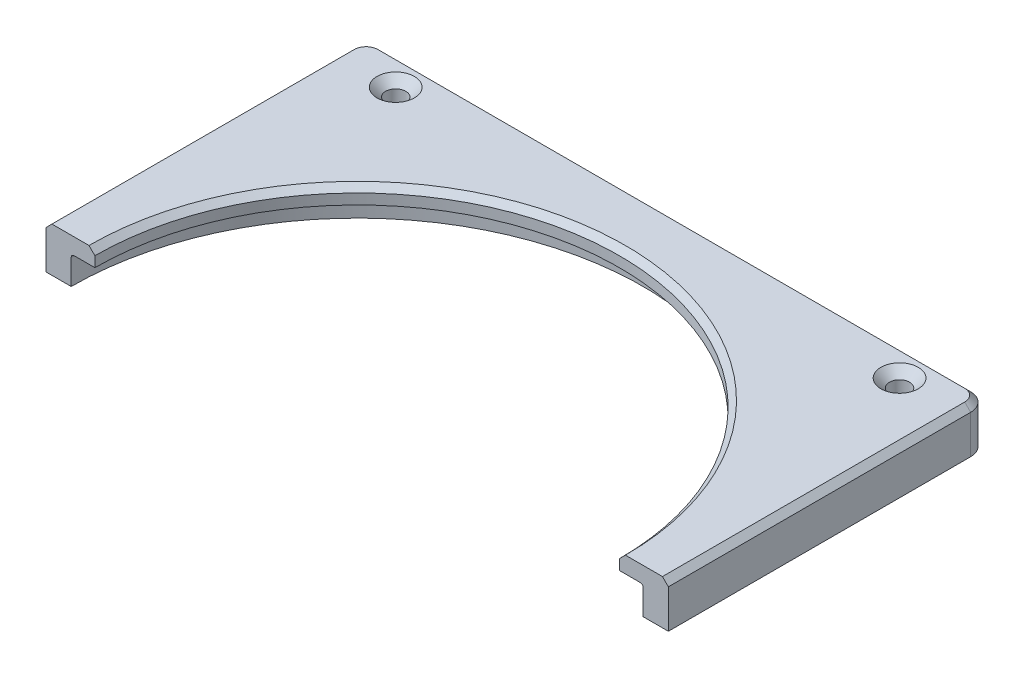
ISO-10303-21;
HEADER;
FILE_DESCRIPTION(('STEP AP214'),'2;1');
FILE_NAME('part.step','',(''),(''),'','','');
FILE_SCHEMA(('AUTOMOTIVE_DESIGN { 1 0 10303 214 1 1 1 1 }'));
ENDSEC;
DATA;
#1=APPLICATION_CONTEXT('core data for automotive mechanical design processes');
#2=APPLICATION_PROTOCOL_DEFINITION('international standard','automotive_design',2000,#1);
#3=PRODUCT_CONTEXT('',#1,'mechanical');
#4=PRODUCT('Part','Part','',(#3));
#5=PRODUCT_RELATED_PRODUCT_CATEGORY('part','',(#4));
#6=PRODUCT_DEFINITION_FORMATION('','',#4);
#7=PRODUCT_DEFINITION_CONTEXT('part definition',#1,'design');
#8=PRODUCT_DEFINITION('design','',#6,#7);
#9=PRODUCT_DEFINITION_SHAPE('','',#8);
#10=(LENGTH_UNIT() NAMED_UNIT(*) SI_UNIT(.MILLI.,.METRE.));
#11=(NAMED_UNIT(*) PLANE_ANGLE_UNIT() SI_UNIT($,.RADIAN.));
#12=(NAMED_UNIT(*) SI_UNIT($,.STERADIAN.) SOLID_ANGLE_UNIT());
#13=UNCERTAINTY_MEASURE_WITH_UNIT(LENGTH_MEASURE(1.E-05),#10,'distance_accuracy_value','');
#14=(GEOMETRIC_REPRESENTATION_CONTEXT(3) GLOBAL_UNCERTAINTY_ASSIGNED_CONTEXT((#13)) GLOBAL_UNIT_ASSIGNED_CONTEXT((#10,
#11,#12)) REPRESENTATION_CONTEXT('',''));
#15=CARTESIAN_POINT('',(0.,0.,0.));
#16=DIRECTION('',(0.,0.,1.));
#17=DIRECTION('',(1.,0.,0.));
#18=AXIS2_PLACEMENT_3D('',#15,#16,#17);
#19=CARTESIAN_POINT('',(-52.5,7.5,27.));
#20=DIRECTION('',(0.,0.,-1.));
#21=DIRECTION('',(-1.,0.,0.));
#22=AXIS2_PLACEMENT_3D('',#19,#20,#21);
#23=PLANE('',#22);
#24=DIRECTION('',(0.,1.,0.));
#25=VECTOR('',#24,1.);
#26=CARTESIAN_POINT('',(-44.25,0.,27.));
#27=LINE('',#26,#25);
#28=CARTESIAN_POINT('',(-44.25,4.75,27.));
#29=VERTEX_POINT('',#28);
#30=CARTESIAN_POINT('',(-44.25,6.49999999999997,27.));
#31=VERTEX_POINT('',#30);
#32=EDGE_CURVE('E175',#29,#31,#27,.T.);
#33=ORIENTED_EDGE('',*,*,#32,.T.);
#34=DIRECTION('',(-0.707106781186545,0.70710678118655,0.));
#35=VECTOR('',#34,1.);
#36=CARTESIAN_POINT('',(0.,-37.7500000000003,27.));
#37=LINE('',#36,#35);
#38=CARTESIAN_POINT('',(-45.25,7.5,27.));
#39=VERTEX_POINT('',#38);
#40=EDGE_CURVE('E210',#31,#39,#37,.T.);
#41=ORIENTED_EDGE('',*,*,#40,.T.);
#42=DIRECTION('',(1.,0.,0.));
#43=VECTOR('',#42,1.);
#44=CARTESIAN_POINT('',(-52.5,7.5,27.));
#45=LINE('',#44,#43);
#46=CARTESIAN_POINT('',(-51.5,7.5,27.));
#47=VERTEX_POINT('',#46);
#48=EDGE_CURVE('E323',#47,#39,#45,.T.);
#49=ORIENTED_EDGE('',*,*,#48,.F.);
#50=DIRECTION('',(-0.707106781186543,-0.707106781186552,0.));
#51=VECTOR('',#50,1.);
#52=CARTESIAN_POINT('',(-51.5,7.5,27.));
#53=LINE('',#52,#51);
#54=CARTESIAN_POINT('',(-52.5,6.49999999999997,27.));
#55=VERTEX_POINT('',#54);
#56=EDGE_CURVE('E207',#47,#55,#53,.T.);
#57=ORIENTED_EDGE('',*,*,#56,.T.);
#58=DIRECTION('',(0.,-1.,0.));
#59=VECTOR('',#58,1.);
#60=CARTESIAN_POINT('',(-52.5,7.5,27.));
#61=LINE('',#60,#59);
#62=CARTESIAN_POINT('',(-52.5,0.,27.));
#63=VERTEX_POINT('',#62);
#64=EDGE_CURVE('E343',#55,#63,#61,.T.);
#65=ORIENTED_EDGE('',*,*,#64,.T.);
#66=DIRECTION('',(1.,0.,0.));
#67=VECTOR('',#66,1.);
#68=CARTESIAN_POINT('',(-52.5,0.,27.));
#69=LINE('',#68,#67);
#70=CARTESIAN_POINT('',(-48.25,0.,27.));
#71=VERTEX_POINT('',#70);
#72=EDGE_CURVE('E324',#63,#71,#69,.T.);
#73=ORIENTED_EDGE('',*,*,#72,.T.);
#74=DIRECTION('',(0.,-1.,0.));
#75=VECTOR('',#74,1.);
#76=CARTESIAN_POINT('',(-48.25,4.75,27.));
#77=LINE('',#76,#75);
#78=CARTESIAN_POINT('',(-48.25,4.25,27.));
#79=VERTEX_POINT('',#78);
#80=EDGE_CURVE('E312',#71,#79,#77,.F.);
#81=ORIENTED_EDGE('',*,*,#80,.T.);
#82=CARTESIAN_POINT('',(-47.75,4.25,27.));
#83=DIRECTION('',(0.,0.,-1.));
#84=DIRECTION('',(-1.,0.,0.));
#85=AXIS2_PLACEMENT_3D('',#82,#83,#84);
#86=CIRCLE('',#85,0.5);
#87=CARTESIAN_POINT('',(-47.75,4.75,27.));
#88=VERTEX_POINT('',#87);
#89=EDGE_CURVE('E11',#79,#88,#86,.T.);
#90=ORIENTED_EDGE('',*,*,#89,.T.);
#91=DIRECTION('',(-1.,0.,0.));
#92=VECTOR('',#91,1.);
#93=CARTESIAN_POINT('',(-52.5,4.75,27.));
#94=LINE('',#93,#92);
#95=EDGE_CURVE('E163',#29,#88,#94,.T.);
#96=ORIENTED_EDGE('',*,*,#95,.F.);
#97=EDGE_LOOP('',(#33,#41,#49,#57,#65,#73,#81,#90,#96));
#98=FACE_BOUND('',#97,.T.);
#99=ADVANCED_FACE('F47',(#98),#23,.F.);
#100=CARTESIAN_POINT('',(52.5,7.5,-27.));
#101=DIRECTION('',(-1.,0.,0.));
#102=DIRECTION('',(0.,0.,1.));
#103=AXIS2_PLACEMENT_3D('',#100,#101,#102);
#104=PLANE('',#103);
#105=DIRECTION('',(0.,-1.,0.));
#106=VECTOR('',#105,1.);
#107=CARTESIAN_POINT('',(52.5,7.5,-24.));
#108=LINE('',#107,#106);
#109=CARTESIAN_POINT('',(52.5,0.,-24.));
#110=VERTEX_POINT('',#109);
#111=CARTESIAN_POINT('',(52.5,6.49999999999997,-24.));
#112=VERTEX_POINT('',#111);
#113=EDGE_CURVE('E200',#110,#112,#108,.F.);
#114=ORIENTED_EDGE('',*,*,#113,.T.);
#115=DIRECTION('',(0.,0.,1.));
#116=VECTOR('',#115,1.);
#117=CARTESIAN_POINT('',(52.5,6.49999999999997,27.));
#118=LINE('',#117,#116);
#119=CARTESIAN_POINT('',(52.5,6.49999999999997,27.));
#120=VERTEX_POINT('',#119);
#121=EDGE_CURVE('E249',#112,#120,#118,.T.);
#122=ORIENTED_EDGE('',*,*,#121,.T.);
#123=DIRECTION('',(0.,-1.,0.));
#124=VECTOR('',#123,1.);
#125=CARTESIAN_POINT('',(52.5,7.5,27.));
#126=LINE('',#125,#124);
#127=CARTESIAN_POINT('',(52.5,0.,27.));
#128=VERTEX_POINT('',#127);
#129=EDGE_CURVE('E340',#120,#128,#126,.T.);
#130=ORIENTED_EDGE('',*,*,#129,.T.);
#131=DIRECTION('',(0.,0.,-1.));
#132=VECTOR('',#131,1.);
#133=CARTESIAN_POINT('',(52.5,0.,-27.));
#134=LINE('',#133,#132);
#135=EDGE_CURVE('E318',#128,#110,#134,.T.);
#136=ORIENTED_EDGE('',*,*,#135,.T.);
#137=EDGE_LOOP('',(#114,#122,#130,#136));
#138=FACE_BOUND('',#137,.T.);
#139=ADVANCED_FACE('F388',(#138),#104,.F.);
#140=CARTESIAN_POINT('',(-52.5,7.5,-27.));
#141=DIRECTION('',(0.,0.,1.));
#142=DIRECTION('',(1.,0.,0.));
#143=AXIS2_PLACEMENT_3D('',#140,#141,#142);
#144=PLANE('',#143);
#145=DIRECTION('',(0.,-1.,0.));
#146=VECTOR('',#145,1.);
#147=CARTESIAN_POINT('',(-49.5,7.5,-27.));
#148=LINE('',#147,#146);
#149=CARTESIAN_POINT('',(-49.5,0.,-27.));
#150=VERTEX_POINT('',#149);
#151=CARTESIAN_POINT('',(-49.5,6.49999999999997,-27.));
#152=VERTEX_POINT('',#151);
#153=EDGE_CURVE('E196',#150,#152,#148,.F.);
#154=ORIENTED_EDGE('',*,*,#153,.T.);
#155=DIRECTION('',(1.,0.,0.));
#156=VECTOR('',#155,1.);
#157=CARTESIAN_POINT('',(49.5,6.49999999999997,-27.));
#158=LINE('',#157,#156);
#159=CARTESIAN_POINT('',(49.5,6.49999999999997,-27.));
#160=VERTEX_POINT('',#159);
#161=EDGE_CURVE('E243',#152,#160,#158,.T.);
#162=ORIENTED_EDGE('',*,*,#161,.T.);
#163=DIRECTION('',(0.,-1.,0.));
#164=VECTOR('',#163,1.);
#165=CARTESIAN_POINT('',(49.5,7.5,-27.));
#166=LINE('',#165,#164);
#167=CARTESIAN_POINT('',(49.5,0.,-27.));
#168=VERTEX_POINT('',#167);
#169=EDGE_CURVE('E193',#160,#168,#166,.T.);
#170=ORIENTED_EDGE('',*,*,#169,.T.);
#171=DIRECTION('',(-1.,0.,0.));
#172=VECTOR('',#171,1.);
#173=CARTESIAN_POINT('',(-52.5,0.,-27.));
#174=LINE('',#173,#172);
#175=EDGE_CURVE('E328',#168,#150,#174,.T.);
#176=ORIENTED_EDGE('',*,*,#175,.T.);
#177=EDGE_LOOP('',(#154,#162,#170,#176));
#178=FACE_BOUND('',#177,.T.);
#179=ADVANCED_FACE('F395',(#178),#144,.F.);
#180=CARTESIAN_POINT('',(-52.5,7.5,-27.));
#181=DIRECTION('',(1.,0.,0.));
#182=DIRECTION('',(0.,0.,-1.));
#183=AXIS2_PLACEMENT_3D('',#180,#181,#182);
#184=PLANE('',#183);
#185=ORIENTED_EDGE('',*,*,#64,.F.);
#186=DIRECTION('',(0.,0.,-1.));
#187=VECTOR('',#186,1.);
#188=CARTESIAN_POINT('',(-52.5,6.49999999999997,-24.));
#189=LINE('',#188,#187);
#190=CARTESIAN_POINT('',(-52.5,6.49999999999997,-24.));
#191=VERTEX_POINT('',#190);
#192=EDGE_CURVE('E237',#55,#191,#189,.T.);
#193=ORIENTED_EDGE('',*,*,#192,.T.);
#194=DIRECTION('',(0.,-1.,0.));
#195=VECTOR('',#194,1.);
#196=CARTESIAN_POINT('',(-52.5,7.5,-24.));
#197=LINE('',#196,#195);
#198=CARTESIAN_POINT('',(-52.5,0.,-24.));
#199=VERTEX_POINT('',#198);
#200=EDGE_CURVE('E181',#191,#199,#197,.T.);
#201=ORIENTED_EDGE('',*,*,#200,.T.);
#202=DIRECTION('',(0.,0.,1.));
#203=VECTOR('',#202,1.);
#204=CARTESIAN_POINT('',(-52.5,0.,-27.));
#205=LINE('',#204,#203);
#206=EDGE_CURVE('E332',#199,#63,#205,.T.);
#207=ORIENTED_EDGE('',*,*,#206,.T.);
#208=EDGE_LOOP('',(#185,#193,#201,#207));
#209=FACE_BOUND('',#208,.T.);
#210=ADVANCED_FACE('F400',(#209),#184,.F.);
#211=CARTESIAN_POINT('',(45.25,7.5,27.));
#212=VERTEX_POINT('',#211);
#213=CARTESIAN_POINT('',(51.5,7.5,27.));
#214=VERTEX_POINT('',#213);
#215=EDGE_CURVE('E319',#212,#214,#45,.T.);
#216=ORIENTED_EDGE('',*,*,#215,.F.);
#217=DIRECTION('',(-0.707106781186545,-0.70710678118655,0.));
#218=VECTOR('',#217,1.);
#219=CARTESIAN_POINT('',(0.,-37.7500000000003,27.));
#220=LINE('',#219,#218);
#221=CARTESIAN_POINT('',(44.25,6.49999999999997,27.));
#222=VERTEX_POINT('',#221);
#223=EDGE_CURVE('E170',#212,#222,#220,.T.);
#224=ORIENTED_EDGE('',*,*,#223,.T.);
#225=DIRECTION('',(0.,1.,0.));
#226=VECTOR('',#225,1.);
#227=CARTESIAN_POINT('',(44.25,0.,27.));
#228=LINE('',#227,#226);
#229=CARTESIAN_POINT('',(44.25,4.75,27.));
#230=VERTEX_POINT('',#229);
#231=EDGE_CURVE('E166',#222,#230,#228,.F.);
#232=ORIENTED_EDGE('',*,*,#231,.T.);
#233=CARTESIAN_POINT('',(47.75,4.75,27.));
#234=VERTEX_POINT('',#233);
#235=EDGE_CURVE('E153',#234,#230,#94,.T.);
#236=ORIENTED_EDGE('',*,*,#235,.F.);
#237=CARTESIAN_POINT('',(47.75,4.25,27.));
#238=DIRECTION('',(0.,0.,-1.));
#239=DIRECTION('',(-1.,0.,0.));
#240=AXIS2_PLACEMENT_3D('',#237,#238,#239);
#241=CIRCLE('',#240,0.5);
#242=CARTESIAN_POINT('',(48.25,4.25,27.));
#243=VERTEX_POINT('',#242);
#244=EDGE_CURVE('E56',#234,#243,#241,.T.);
#245=ORIENTED_EDGE('',*,*,#244,.T.);
#246=DIRECTION('',(0.,-1.,0.));
#247=VECTOR('',#246,1.);
#248=CARTESIAN_POINT('',(48.25,4.75,27.));
#249=LINE('',#248,#247);
#250=CARTESIAN_POINT('',(48.25,0.,27.));
#251=VERTEX_POINT('',#250);
#252=EDGE_CURVE('E315',#243,#251,#249,.T.);
#253=ORIENTED_EDGE('',*,*,#252,.T.);
#254=EDGE_CURVE('E336',#251,#128,#69,.T.);
#255=ORIENTED_EDGE('',*,*,#254,.T.);
#256=ORIENTED_EDGE('',*,*,#129,.F.);
#257=DIRECTION('',(-0.707106781186543,0.707106781186552,0.));
#258=VECTOR('',#257,1.);
#259=CARTESIAN_POINT('',(51.5,7.5,27.));
#260=LINE('',#259,#258);
#261=EDGE_CURVE('E232',#120,#214,#260,.T.);
#262=ORIENTED_EDGE('',*,*,#261,.T.);
#263=EDGE_LOOP('',(#216,#224,#232,#236,#245,#253,#255,#256,#262));
#264=FACE_BOUND('',#263,.T.);
#265=ADVANCED_FACE('F168',(#264),#23,.F.);
#266=CARTESIAN_POINT('',(0.,7.5,0.));
#267=DIRECTION('',(0.,1.,0.));
#268=DIRECTION('',(0.,0.,1.));
#269=AXIS2_PLACEMENT_3D('',#266,#267,#268);
#270=PLANE('',#269);
#271=CARTESIAN_POINT('',(-42.5,7.5,-22.));
#272=DIRECTION('',(0.,1.,0.));
#273=DIRECTION('',(0.,0.,1.));
#274=AXIS2_PLACEMENT_3D('',#271,#272,#273);
#275=CIRCLE('',#274,3.15);
#276=CARTESIAN_POINT('',(-42.5,7.5,-18.85));
#277=VERTEX_POINT('',#276);
#278=EDGE_CURVE('E279',#277,#277,#275,.T.);
#279=ORIENTED_EDGE('',*,*,#278,.F.);
#280=EDGE_LOOP('',(#279));
#281=FACE_BOUND('',#280,.T.);
#282=CARTESIAN_POINT('',(42.5,7.5,-22.));
#283=DIRECTION('',(0.,1.,0.));
#284=DIRECTION('',(0.,0.,1.));
#285=AXIS2_PLACEMENT_3D('',#282,#283,#284);
#286=CIRCLE('',#285,3.15);
#287=CARTESIAN_POINT('',(42.5,7.5,-18.85));
#288=VERTEX_POINT('',#287);
#289=EDGE_CURVE('E299',#288,#288,#286,.T.);
#290=ORIENTED_EDGE('',*,*,#289,.F.);
#291=EDGE_LOOP('',(#290));
#292=FACE_BOUND('',#291,.T.);
#293=ORIENTED_EDGE('',*,*,#48,.T.);
#294=CARTESIAN_POINT('',(0.,7.5,27.));
#295=DIRECTION('',(0.,1.,0.));
#296=DIRECTION('',(0.,0.,1.));
#297=AXIS2_PLACEMENT_3D('',#294,#295,#296);
#298=CIRCLE('',#297,45.25);
#299=EDGE_CURVE('E229',#39,#212,#298,.F.);
#300=ORIENTED_EDGE('',*,*,#299,.T.);
#301=ORIENTED_EDGE('',*,*,#215,.T.);
#302=DIRECTION('',(0.,0.,-1.));
#303=VECTOR('',#302,1.);
#304=CARTESIAN_POINT('',(51.5,7.5,-24.));
#305=LINE('',#304,#303);
#306=CARTESIAN_POINT('',(51.5,7.5,-24.));
#307=VERTEX_POINT('',#306);
#308=EDGE_CURVE('E213',#214,#307,#305,.T.);
#309=ORIENTED_EDGE('',*,*,#308,.T.);
#310=CARTESIAN_POINT('',(49.5,7.5,-24.));
#311=DIRECTION('',(0.,1.,0.));
#312=DIRECTION('',(0.,0.,1.));
#313=AXIS2_PLACEMENT_3D('',#310,#311,#312);
#314=CIRCLE('',#313,1.99999999999999);
#315=CARTESIAN_POINT('',(49.5,7.5,-26.));
#316=VERTEX_POINT('',#315);
#317=EDGE_CURVE('E216',#307,#316,#314,.T.);
#318=ORIENTED_EDGE('',*,*,#317,.T.);
#319=DIRECTION('',(-1.,0.,0.));
#320=VECTOR('',#319,1.);
#321=CARTESIAN_POINT('',(-49.5,7.5,-26.));
#322=LINE('',#321,#320);
#323=CARTESIAN_POINT('',(-49.5,7.5,-26.));
#324=VERTEX_POINT('',#323);
#325=EDGE_CURVE('E219',#316,#324,#322,.T.);
#326=ORIENTED_EDGE('',*,*,#325,.T.);
#327=CARTESIAN_POINT('',(-49.5,7.5,-24.));
#328=DIRECTION('',(0.,1.,0.));
#329=DIRECTION('',(0.,0.,1.));
#330=AXIS2_PLACEMENT_3D('',#327,#328,#329);
#331=CIRCLE('',#330,1.99999999999998);
#332=CARTESIAN_POINT('',(-51.5,7.5,-24.));
#333=VERTEX_POINT('',#332);
#334=EDGE_CURVE('E222',#324,#333,#331,.T.);
#335=ORIENTED_EDGE('',*,*,#334,.T.);
#336=DIRECTION('',(0.,0.,1.));
#337=VECTOR('',#336,1.);
#338=CARTESIAN_POINT('',(-51.5,7.5,27.));
#339=LINE('',#338,#337);
#340=EDGE_CURVE('E225',#333,#47,#339,.T.);
#341=ORIENTED_EDGE('',*,*,#340,.T.);
#342=EDGE_LOOP('',(#293,#300,#301,#309,#318,#326,#335,#341));
#343=FACE_BOUND('',#342,.T.);
#344=ADVANCED_FACE('F368',(#281,#292,#343),#270,.T.);
#345=CARTESIAN_POINT('',(0.,0.,0.));
#346=DIRECTION('',(0.,1.,0.));
#347=DIRECTION('',(0.,0.,1.));
#348=AXIS2_PLACEMENT_3D('',#345,#346,#347);
#349=PLANE('',#348);
#350=CARTESIAN_POINT('',(-42.5,0.,-22.));
#351=DIRECTION('',(0.,1.,0.));
#352=DIRECTION('',(0.,0.,1.));
#353=AXIS2_PLACEMENT_3D('',#350,#351,#352);
#354=CIRCLE('',#353,2.2);
#355=CARTESIAN_POINT('',(-42.5,0.,-19.8));
#356=VERTEX_POINT('',#355);
#357=EDGE_CURVE('E268',#356,#356,#354,.T.);
#358=ORIENTED_EDGE('',*,*,#357,.T.);
#359=EDGE_LOOP('',(#358));
#360=FACE_BOUND('',#359,.T.);
#361=CARTESIAN_POINT('',(42.5,0.,-22.));
#362=DIRECTION('',(0.,1.,0.));
#363=DIRECTION('',(0.,0.,1.));
#364=AXIS2_PLACEMENT_3D('',#361,#362,#363);
#365=CIRCLE('',#364,2.2);
#366=CARTESIAN_POINT('',(42.5,0.,-19.8));
#367=VERTEX_POINT('',#366);
#368=EDGE_CURVE('E295',#367,#367,#365,.T.);
#369=ORIENTED_EDGE('',*,*,#368,.T.);
#370=EDGE_LOOP('',(#369));
#371=FACE_BOUND('',#370,.T.);
#372=ORIENTED_EDGE('',*,*,#206,.F.);
#373=CARTESIAN_POINT('',(-49.5,0.,-24.));
#374=DIRECTION('',(0.,1.,0.));
#375=DIRECTION('',(0.,0.,1.));
#376=AXIS2_PLACEMENT_3D('',#373,#374,#375);
#377=CIRCLE('',#376,3.);
#378=EDGE_CURVE('E190',#199,#150,#377,.F.);
#379=ORIENTED_EDGE('',*,*,#378,.T.);
#380=ORIENTED_EDGE('',*,*,#175,.F.);
#381=CARTESIAN_POINT('',(49.5,0.,-24.));
#382=DIRECTION('',(0.,1.,0.));
#383=DIRECTION('',(0.,0.,1.));
#384=AXIS2_PLACEMENT_3D('',#381,#382,#383);
#385=CIRCLE('',#384,3.);
#386=EDGE_CURVE('E184',#168,#110,#385,.F.);
#387=ORIENTED_EDGE('',*,*,#386,.T.);
#388=ORIENTED_EDGE('',*,*,#135,.F.);
#389=ORIENTED_EDGE('',*,*,#254,.F.);
#390=CARTESIAN_POINT('',(0.,0.,27.));
#391=DIRECTION('',(0.,1.,0.));
#392=DIRECTION('',(0.,0.,1.));
#393=AXIS2_PLACEMENT_3D('',#390,#391,#392);
#394=CIRCLE('',#393,48.25);
#395=EDGE_CURVE('E345',#251,#71,#394,.T.);
#396=ORIENTED_EDGE('',*,*,#395,.T.);
#397=ORIENTED_EDGE('',*,*,#72,.F.);
#398=EDGE_LOOP('',(#372,#379,#380,#387,#388,#389,#396,#397));
#399=FACE_BOUND('',#398,.T.);
#400=ADVANCED_FACE('F360',(#360,#371,#399),#349,.F.);
#401=CARTESIAN_POINT('',(0.,4.75,27.));
#402=DIRECTION('',(0.,-1.,0.));
#403=DIRECTION('',(0.,0.,-1.));
#404=AXIS2_PLACEMENT_3D('',#401,#402,#403);
#405=PLANE('',#404);
#406=ORIENTED_EDGE('',*,*,#95,.T.);
#407=CARTESIAN_POINT('',(0.,4.75,27.));
#408=DIRECTION('',(0.,-1.,0.));
#409=DIRECTION('',(0.,0.,-1.));
#410=AXIS2_PLACEMENT_3D('',#407,#408,#409);
#411=CIRCLE('',#410,47.75);
#412=EDGE_CURVE('E161',#88,#234,#411,.T.);
#413=ORIENTED_EDGE('',*,*,#412,.T.);
#414=ORIENTED_EDGE('',*,*,#235,.T.);
#415=CARTESIAN_POINT('',(0.,4.75,27.));
#416=DIRECTION('',(0.,-1.,0.));
#417=DIRECTION('',(0.,0.,-1.));
#418=AXIS2_PLACEMENT_3D('',#415,#416,#417);
#419=CIRCLE('',#418,44.25);
#420=EDGE_CURVE('E158',#29,#230,#419,.T.);
#421=ORIENTED_EDGE('',*,*,#420,.F.);
#422=EDGE_LOOP('',(#406,#413,#414,#421));
#423=FACE_BOUND('',#422,.T.);
#424=ADVANCED_FACE('F156',(#423),#405,.T.);
#425=CARTESIAN_POINT('',(0.,4.75,27.));
#426=DIRECTION('',(0.,-1.,0.));
#427=DIRECTION('',(0.,0.,-1.));
#428=AXIS2_PLACEMENT_3D('',#425,#426,#427);
#429=CYLINDRICAL_SURFACE('',#428,48.25);
#430=ORIENTED_EDGE('',*,*,#252,.F.);
#431=CARTESIAN_POINT('',(0.,4.25,27.));
#432=DIRECTION('',(0.,-1.,0.));
#433=DIRECTION('',(0.,0.,-1.));
#434=AXIS2_PLACEMENT_3D('',#431,#432,#433);
#435=CIRCLE('',#434,48.25);
#436=EDGE_CURVE('E69',#243,#79,#435,.F.);
#437=ORIENTED_EDGE('',*,*,#436,.T.);
#438=ORIENTED_EDGE('',*,*,#80,.F.);
#439=ORIENTED_EDGE('',*,*,#395,.F.);
#440=EDGE_LOOP('',(#430,#437,#438,#439));
#441=FACE_BOUND('',#440,.T.);
#442=ADVANCED_FACE('F356',(#441),#429,.F.);
#443=CARTESIAN_POINT('',(0.,0.,27.));
#444=DIRECTION('',(0.,1.,0.));
#445=DIRECTION('',(0.,0.,1.));
#446=AXIS2_PLACEMENT_3D('',#443,#444,#445);
#447=CYLINDRICAL_SURFACE('',#446,44.25);
#448=ORIENTED_EDGE('',*,*,#231,.F.);
#449=CARTESIAN_POINT('',(0.,6.49999999999997,27.));
#450=DIRECTION('',(0.,1.,0.));
#451=DIRECTION('',(0.,0.,1.));
#452=AXIS2_PLACEMENT_3D('',#449,#450,#451);
#453=CIRCLE('',#452,44.25);
#454=EDGE_CURVE('E204',#222,#31,#453,.T.);
#455=ORIENTED_EDGE('',*,*,#454,.T.);
#456=ORIENTED_EDGE('',*,*,#32,.F.);
#457=ORIENTED_EDGE('',*,*,#420,.T.);
#458=EDGE_LOOP('',(#448,#455,#456,#457));
#459=FACE_BOUND('',#458,.T.);
#460=ADVANCED_FACE('F178',(#459),#447,.F.);
#461=CARTESIAN_POINT('',(42.5,0.500000000000021,-22.));
#462=DIRECTION('',(0.,-1.,0.));
#463=DIRECTION('',(0.,0.,-1.));
#464=AXIS2_PLACEMENT_3D('',#461,#462,#463);
#465=CONICAL_SURFACE('',#464,1.69999999999999,0.785398163397448);
#466=ORIENTED_EDGE('',*,*,#368,.F.);
#467=EDGE_LOOP('',(#466));
#468=FACE_BOUND('',#467,.T.);
#469=CARTESIAN_POINT('',(42.5,0.500000000000021,-22.));
#470=DIRECTION('',(0.,1.,0.));
#471=DIRECTION('',(0.,0.,1.));
#472=AXIS2_PLACEMENT_3D('',#469,#470,#471);
#473=CIRCLE('',#472,1.69999999999999);
#474=CARTESIAN_POINT('',(42.5,0.500000000000021,-20.3));
#475=VERTEX_POINT('',#474);
#476=EDGE_CURVE('E176',#475,#475,#473,.T.);
#477=ORIENTED_EDGE('',*,*,#476,.T.);
#478=EDGE_LOOP('',(#477));
#479=FACE_BOUND('',#478,.T.);
#480=ADVANCED_FACE('F533',(#468,#479),#465,.F.);
#481=CARTESIAN_POINT('',(42.5,7.5,-22.));
#482=DIRECTION('',(0.,1.,0.));
#483=DIRECTION('',(0.,0.,1.));
#484=AXIS2_PLACEMENT_3D('',#481,#482,#483);
#485=CYLINDRICAL_SURFACE('',#484,1.69999999999999);
#486=ORIENTED_EDGE('',*,*,#476,.F.);
#487=EDGE_LOOP('',(#486));
#488=FACE_BOUND('',#487,.T.);
#489=CARTESIAN_POINT('',(42.5,6.04999999999999,-22.));
#490=DIRECTION('',(0.,1.,0.));
#491=DIRECTION('',(0.,0.,1.));
#492=AXIS2_PLACEMENT_3D('',#489,#490,#491);
#493=CIRCLE('',#492,1.69999999999999);
#494=CARTESIAN_POINT('',(42.5,6.04999999999999,-20.3));
#495=VERTEX_POINT('',#494);
#496=EDGE_CURVE('E303',#495,#495,#493,.T.);
#497=ORIENTED_EDGE('',*,*,#496,.T.);
#498=EDGE_LOOP('',(#497));
#499=FACE_BOUND('',#498,.T.);
#500=ADVANCED_FACE('F547',(#488,#499),#485,.F.);
#501=CARTESIAN_POINT('',(42.5,7.5,-22.));
#502=DIRECTION('',(0.,1.,0.));
#503=DIRECTION('',(0.,0.,1.));
#504=AXIS2_PLACEMENT_3D('',#501,#502,#503);
#505=CONICAL_SURFACE('',#504,3.15,0.78539816339745);
#506=ORIENTED_EDGE('',*,*,#496,.F.);
#507=EDGE_LOOP('',(#506));
#508=FACE_BOUND('',#507,.T.);
#509=ORIENTED_EDGE('',*,*,#289,.T.);
#510=EDGE_LOOP('',(#509));
#511=FACE_BOUND('',#510,.T.);
#512=ADVANCED_FACE('F557',(#508,#511),#505,.F.);
#513=CARTESIAN_POINT('',(-42.5,0.500000000000021,-22.));
#514=DIRECTION('',(0.,-1.,0.));
#515=DIRECTION('',(0.,0.,-1.));
#516=AXIS2_PLACEMENT_3D('',#513,#514,#515);
#517=CONICAL_SURFACE('',#516,1.69999999999999,0.785398163397448);
#518=ORIENTED_EDGE('',*,*,#357,.F.);
#519=EDGE_LOOP('',(#518));
#520=FACE_BOUND('',#519,.T.);
#521=CARTESIAN_POINT('',(-42.5,0.500000000000021,-22.));
#522=DIRECTION('',(0.,1.,0.));
#523=DIRECTION('',(0.,0.,1.));
#524=AXIS2_PLACEMENT_3D('',#521,#522,#523);
#525=CIRCLE('',#524,1.69999999999999);
#526=CARTESIAN_POINT('',(-42.5,0.500000000000021,-20.3));
#527=VERTEX_POINT('',#526);
#528=EDGE_CURVE('E291',#527,#527,#525,.T.);
#529=ORIENTED_EDGE('',*,*,#528,.T.);
#530=EDGE_LOOP('',(#529));
#531=FACE_BOUND('',#530,.T.);
#532=ADVANCED_FACE('F567',(#520,#531),#517,.F.);
#533=CARTESIAN_POINT('',(-42.5,7.5,-22.));
#534=DIRECTION('',(0.,1.,0.));
#535=DIRECTION('',(0.,0.,1.));
#536=AXIS2_PLACEMENT_3D('',#533,#534,#535);
#537=CYLINDRICAL_SURFACE('',#536,1.69999999999999);
#538=ORIENTED_EDGE('',*,*,#528,.F.);
#539=EDGE_LOOP('',(#538));
#540=FACE_BOUND('',#539,.T.);
#541=CARTESIAN_POINT('',(-42.5,6.04999999999999,-22.));
#542=DIRECTION('',(0.,1.,0.));
#543=DIRECTION('',(0.,0.,1.));
#544=AXIS2_PLACEMENT_3D('',#541,#542,#543);
#545=CIRCLE('',#544,1.69999999999999);
#546=CARTESIAN_POINT('',(-42.5,6.04999999999999,-20.3));
#547=VERTEX_POINT('',#546);
#548=EDGE_CURVE('E285',#547,#547,#545,.T.);
#549=ORIENTED_EDGE('',*,*,#548,.T.);
#550=EDGE_LOOP('',(#549));
#551=FACE_BOUND('',#550,.T.);
#552=ADVANCED_FACE('F423',(#540,#551),#537,.F.);
#553=CARTESIAN_POINT('',(-42.5,7.5,-22.));
#554=DIRECTION('',(0.,1.,0.));
#555=DIRECTION('',(0.,0.,1.));
#556=AXIS2_PLACEMENT_3D('',#553,#554,#555);
#557=CONICAL_SURFACE('',#556,3.15,0.78539816339745);
#558=ORIENTED_EDGE('',*,*,#548,.F.);
#559=EDGE_LOOP('',(#558));
#560=FACE_BOUND('',#559,.T.);
#561=ORIENTED_EDGE('',*,*,#278,.T.);
#562=EDGE_LOOP('',(#561));
#563=FACE_BOUND('',#562,.T.);
#564=ADVANCED_FACE('F417',(#560,#563),#557,.F.);
#565=CARTESIAN_POINT('',(-49.5,7.5,-24.));
#566=DIRECTION('',(0.,-1.,0.));
#567=DIRECTION('',(0.,0.,-1.));
#568=AXIS2_PLACEMENT_3D('',#565,#566,#567);
#569=CYLINDRICAL_SURFACE('',#568,3.);
#570=ORIENTED_EDGE('',*,*,#200,.F.);
#571=CARTESIAN_POINT('',(-49.5,6.49999999999997,-24.));
#572=DIRECTION('',(0.,1.,0.));
#573=DIRECTION('',(0.,0.,1.));
#574=AXIS2_PLACEMENT_3D('',#571,#572,#573);
#575=CIRCLE('',#574,3.);
#576=EDGE_CURVE('E240',#191,#152,#575,.F.);
#577=ORIENTED_EDGE('',*,*,#576,.T.);
#578=ORIENTED_EDGE('',*,*,#153,.F.);
#579=ORIENTED_EDGE('',*,*,#378,.F.);
#580=EDGE_LOOP('',(#570,#577,#578,#579));
#581=FACE_BOUND('',#580,.T.);
#582=ADVANCED_FACE('F382',(#581),#569,.T.);
#583=CARTESIAN_POINT('',(49.5,7.5,-24.));
#584=DIRECTION('',(0.,-1.,0.));
#585=DIRECTION('',(0.,0.,-1.));
#586=AXIS2_PLACEMENT_3D('',#583,#584,#585);
#587=CYLINDRICAL_SURFACE('',#586,3.);
#588=ORIENTED_EDGE('',*,*,#169,.F.);
#589=CARTESIAN_POINT('',(49.5,6.49999999999997,-24.));
#590=DIRECTION('',(0.,1.,0.));
#591=DIRECTION('',(0.,0.,1.));
#592=AXIS2_PLACEMENT_3D('',#589,#590,#591);
#593=CIRCLE('',#592,3.);
#594=EDGE_CURVE('E246',#160,#112,#593,.F.);
#595=ORIENTED_EDGE('',*,*,#594,.T.);
#596=ORIENTED_EDGE('',*,*,#113,.F.);
#597=ORIENTED_EDGE('',*,*,#386,.F.);
#598=EDGE_LOOP('',(#588,#595,#596,#597));
#599=FACE_BOUND('',#598,.T.);
#600=ADVANCED_FACE('F374',(#599),#587,.T.);
#601=CARTESIAN_POINT('',(0.,6.49999999999997,27.));
#602=DIRECTION('',(0.,1.,0.));
#603=DIRECTION('',(0.,0.,1.));
#604=AXIS2_PLACEMENT_3D('',#601,#602,#603);
#605=CONICAL_SURFACE('',#604,44.25,0.785398163397445);
#606=ORIENTED_EDGE('',*,*,#223,.F.);
#607=ORIENTED_EDGE('',*,*,#299,.F.);
#608=ORIENTED_EDGE('',*,*,#40,.F.);
#609=ORIENTED_EDGE('',*,*,#454,.F.);
#610=EDGE_LOOP('',(#606,#607,#608,#609));
#611=FACE_BOUND('',#610,.T.);
#612=ADVANCED_FACE('F371',(#611),#605,.F.);
#613=CARTESIAN_POINT('',(51.5,7.5,0.));
#614=DIRECTION('',(0.707106781186552,0.707106781186543,0.));
#615=DIRECTION('',(0.,0.,1.));
#616=AXIS2_PLACEMENT_3D('',#613,#614,#615);
#617=PLANE('',#616);
#618=ORIENTED_EDGE('',*,*,#261,.F.);
#619=ORIENTED_EDGE('',*,*,#121,.F.);
#620=DIRECTION('',(0.707106781186543,-0.707106781186552,0.));
#621=VECTOR('',#620,1.);
#622=CARTESIAN_POINT('',(51.5,7.5,-24.));
#623=LINE('',#622,#621);
#624=EDGE_CURVE('E264',#307,#112,#623,.T.);
#625=ORIENTED_EDGE('',*,*,#624,.F.);
#626=ORIENTED_EDGE('',*,*,#308,.F.);
#627=EDGE_LOOP('',(#618,#619,#625,#626));
#628=FACE_BOUND('',#627,.T.);
#629=ADVANCED_FACE('F373',(#628),#617,.T.);
#630=CARTESIAN_POINT('',(49.5,7.5,-24.));
#631=DIRECTION('',(0.,-1.,0.));
#632=DIRECTION('',(0.,0.,-1.));
#633=AXIS2_PLACEMENT_3D('',#630,#631,#632);
#634=CONICAL_SURFACE('',#633,1.99999999999999,0.78539816339744);
#635=ORIENTED_EDGE('',*,*,#624,.T.);
#636=ORIENTED_EDGE('',*,*,#594,.F.);
#637=DIRECTION('',(0.,-0.707106781186554,-0.707106781186541));
#638=VECTOR('',#637,1.);
#639=CARTESIAN_POINT('',(49.5,7.5,-26.));
#640=LINE('',#639,#638);
#641=EDGE_CURVE('E260',#316,#160,#640,.T.);
#642=ORIENTED_EDGE('',*,*,#641,.F.);
#643=ORIENTED_EDGE('',*,*,#317,.F.);
#644=EDGE_LOOP('',(#635,#636,#642,#643));
#645=FACE_BOUND('',#644,.T.);
#646=ADVANCED_FACE('F380',(#645),#634,.T.);
#647=CARTESIAN_POINT('',(0.,7.5,-26.));
#648=DIRECTION('',(0.,0.707106781186543,-0.707106781186552));
#649=DIRECTION('',(1.,0.,0.));
#650=AXIS2_PLACEMENT_3D('',#647,#648,#649);
#651=PLANE('',#650);
#652=ORIENTED_EDGE('',*,*,#641,.T.);
#653=ORIENTED_EDGE('',*,*,#161,.F.);
#654=DIRECTION('',(0.,-0.707106781186552,-0.707106781186543));
#655=VECTOR('',#654,1.);
#656=CARTESIAN_POINT('',(-49.5,7.5,-26.));
#657=LINE('',#656,#655);
#658=EDGE_CURVE('E256',#324,#152,#657,.T.);
#659=ORIENTED_EDGE('',*,*,#658,.F.);
#660=ORIENTED_EDGE('',*,*,#325,.F.);
#661=EDGE_LOOP('',(#652,#653,#659,#660));
#662=FACE_BOUND('',#661,.T.);
#663=ADVANCED_FACE('F449',(#662),#651,.T.);
#664=CARTESIAN_POINT('',(-49.5,7.5,-24.));
#665=DIRECTION('',(0.,-1.,0.));
#666=DIRECTION('',(0.,0.,-1.));
#667=AXIS2_PLACEMENT_3D('',#664,#665,#666);
#668=CONICAL_SURFACE('',#667,1.99999999999998,0.785398163397442);
#669=ORIENTED_EDGE('',*,*,#658,.T.);
#670=ORIENTED_EDGE('',*,*,#576,.F.);
#671=DIRECTION('',(-0.707106781186545,-0.70710678118655,0.));
#672=VECTOR('',#671,1.);
#673=CARTESIAN_POINT('',(-51.5,7.5,-24.));
#674=LINE('',#673,#672);
#675=EDGE_CURVE('E252',#333,#191,#674,.T.);
#676=ORIENTED_EDGE('',*,*,#675,.F.);
#677=ORIENTED_EDGE('',*,*,#334,.F.);
#678=EDGE_LOOP('',(#669,#670,#676,#677));
#679=FACE_BOUND('',#678,.T.);
#680=ADVANCED_FACE('F432',(#679),#668,.T.);
#681=CARTESIAN_POINT('',(-51.5,7.5,0.));
#682=DIRECTION('',(-0.707106781186552,0.707106781186543,0.));
#683=DIRECTION('',(0.,0.,-1.));
#684=AXIS2_PLACEMENT_3D('',#681,#682,#683);
#685=PLANE('',#684);
#686=ORIENTED_EDGE('',*,*,#675,.T.);
#687=ORIENTED_EDGE('',*,*,#192,.F.);
#688=ORIENTED_EDGE('',*,*,#56,.F.);
#689=ORIENTED_EDGE('',*,*,#340,.F.);
#690=EDGE_LOOP('',(#686,#687,#688,#689));
#691=FACE_BOUND('',#690,.T.);
#692=ADVANCED_FACE('F437',(#691),#685,.T.);
#693=CARTESIAN_POINT('',(0.,4.25,27.));
#694=DIRECTION('',(0.,-1.,0.));
#695=DIRECTION('',(0.,0.,-1.));
#696=AXIS2_PLACEMENT_3D('',#693,#694,#695);
#697=TOROIDAL_SURFACE('',#696,47.75,0.5);
#698=ORIENTED_EDGE('',*,*,#89,.F.);
#699=ORIENTED_EDGE('',*,*,#436,.F.);
#700=ORIENTED_EDGE('',*,*,#244,.F.);
#701=ORIENTED_EDGE('',*,*,#412,.F.);
#702=EDGE_LOOP('',(#698,#699,#700,#701));
#703=FACE_BOUND('',#702,.T.);
#704=ADVANCED_FACE('F49',(#703),#697,.F.);
#705=CLOSED_SHELL('',(#99,#139,#179,#210,#265,#344,#400,#424,#442,#460,#480,#500,#512,#532,#552,
#564,#582,#600,#612,#629,#646,#663,#680,#692,#704));
#706=MANIFOLD_SOLID_BREP('B2',#705);
#707=ADVANCED_BREP_SHAPE_REPRESENTATION('',(#18,#706),#14);
#708=SHAPE_DEFINITION_REPRESENTATION(#9,#707);
ENDSEC;
END-ISO-10303-21;
